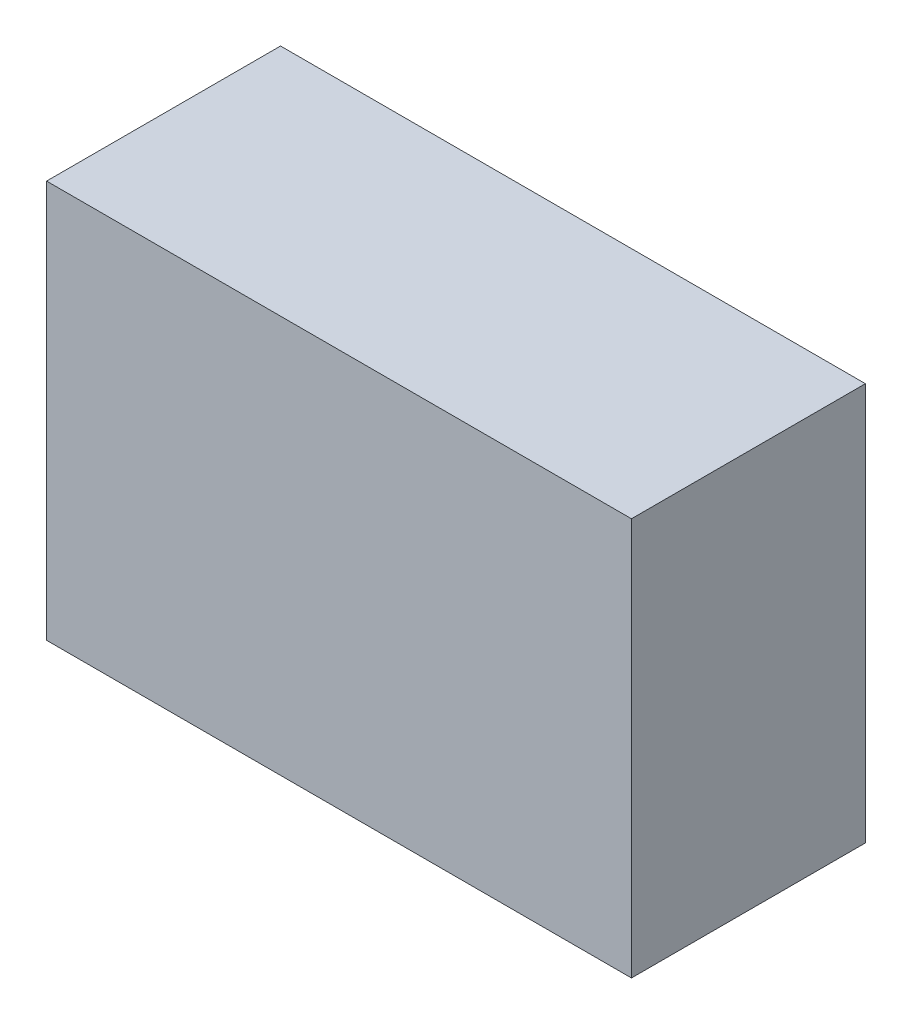
ISO-10303-21;
HEADER;
FILE_DESCRIPTION(('STEP AP214'),'2;1');
FILE_NAME('part.step','',(''),(''),'','','');
FILE_SCHEMA(('AUTOMOTIVE_DESIGN { 1 0 10303 214 1 1 1 1 }'));
ENDSEC;
DATA;
#1=APPLICATION_CONTEXT('core data for automotive mechanical design processes');
#2=APPLICATION_PROTOCOL_DEFINITION('international standard','automotive_design',2000,#1);
#3=PRODUCT_CONTEXT('',#1,'mechanical');
#4=PRODUCT('Part','Part','',(#3));
#5=PRODUCT_RELATED_PRODUCT_CATEGORY('part','',(#4));
#6=PRODUCT_DEFINITION_FORMATION('','',#4);
#7=PRODUCT_DEFINITION_CONTEXT('part definition',#1,'design');
#8=PRODUCT_DEFINITION('design','',#6,#7);
#9=PRODUCT_DEFINITION_SHAPE('','',#8);
#10=(LENGTH_UNIT() NAMED_UNIT(*) SI_UNIT(.MILLI.,.METRE.));
#11=(NAMED_UNIT(*) PLANE_ANGLE_UNIT() SI_UNIT($,.RADIAN.));
#12=(NAMED_UNIT(*) SI_UNIT($,.STERADIAN.) SOLID_ANGLE_UNIT());
#13=UNCERTAINTY_MEASURE_WITH_UNIT(LENGTH_MEASURE(1.E-05),#10,'distance_accuracy_value','');
#14=(GEOMETRIC_REPRESENTATION_CONTEXT(3) GLOBAL_UNCERTAINTY_ASSIGNED_CONTEXT((#13)) GLOBAL_UNIT_ASSIGNED_CONTEXT((#10,
#11,#12)) REPRESENTATION_CONTEXT('',''));
#15=CARTESIAN_POINT('',(0.,0.,0.));
#16=DIRECTION('',(0.,0.,1.));
#17=DIRECTION('',(1.,0.,0.));
#18=AXIS2_PLACEMENT_3D('',#15,#16,#17);
#19=CARTESIAN_POINT('',(-40.4296875,27.5390625,-20.));
#20=DIRECTION('',(-1.,0.,0.));
#21=DIRECTION('',(0.,0.,1.));
#22=AXIS2_PLACEMENT_3D('',#19,#20,#21);
#23=PLANE('',#22);
#24=DIRECTION('',(0.,-1.,0.));
#25=VECTOR('',#24,1.);
#26=CARTESIAN_POINT('',(-40.4296875,27.5390625,0.));
#27=LINE('',#26,#25);
#28=CARTESIAN_POINT('',(-40.4296875,27.5390625,0.));
#29=VERTEX_POINT('',#28);
#30=CARTESIAN_POINT('',(-40.4296875,-6.46093750000001,0.));
#31=VERTEX_POINT('',#30);
#32=EDGE_CURVE('E109',#29,#31,#27,.T.);
#33=ORIENTED_EDGE('',*,*,#32,.F.);
#34=DIRECTION('',(0.,0.,1.));
#35=VECTOR('',#34,1.);
#36=CARTESIAN_POINT('',(-40.4296875,27.5390625,-20.));
#37=LINE('',#36,#35);
#38=CARTESIAN_POINT('',(-40.4296875,27.5390625,-20.));
#39=VERTEX_POINT('',#38);
#40=EDGE_CURVE('E11',#39,#29,#37,.T.);
#41=ORIENTED_EDGE('',*,*,#40,.F.);
#42=DIRECTION('',(0.,-1.,0.));
#43=VECTOR('',#42,1.);
#44=CARTESIAN_POINT('',(-40.4296875,27.5390625,-20.));
#45=LINE('',#44,#43);
#46=CARTESIAN_POINT('',(-40.4296875,-6.46093750000001,-20.));
#47=VERTEX_POINT('',#46);
#48=EDGE_CURVE('E101',#39,#47,#45,.T.);
#49=ORIENTED_EDGE('',*,*,#48,.T.);
#50=DIRECTION('',(0.,0.,1.));
#51=VECTOR('',#50,1.);
#52=CARTESIAN_POINT('',(-40.4296875,-6.46093750000001,-20.));
#53=LINE('',#52,#51);
#54=EDGE_CURVE('E42',#47,#31,#53,.T.);
#55=ORIENTED_EDGE('',*,*,#54,.T.);
#56=EDGE_LOOP('',(#33,#41,#49,#55));
#57=FACE_BOUND('',#56,.T.);
#58=ADVANCED_FACE('F39',(#57),#23,.T.);
#59=CARTESIAN_POINT('',(-40.4296875,27.5390625,-20.));
#60=DIRECTION('',(0.,1.,0.));
#61=DIRECTION('',(0.,0.,1.));
#62=AXIS2_PLACEMENT_3D('',#59,#60,#61);
#63=PLANE('',#62);
#64=DIRECTION('',(-1.,0.,0.));
#65=VECTOR('',#64,1.);
#66=CARTESIAN_POINT('',(-40.4296875,27.5390625,0.));
#67=LINE('',#66,#65);
#68=CARTESIAN_POINT('',(9.57031250000002,27.5390625,0.));
#69=VERTEX_POINT('',#68);
#70=EDGE_CURVE('E104',#69,#29,#67,.T.);
#71=ORIENTED_EDGE('',*,*,#70,.F.);
#72=DIRECTION('',(0.,0.,1.));
#73=VECTOR('',#72,1.);
#74=CARTESIAN_POINT('',(9.57031250000002,27.5390625,-20.));
#75=LINE('',#74,#73);
#76=CARTESIAN_POINT('',(9.57031250000002,27.5390625,-20.));
#77=VERTEX_POINT('',#76);
#78=EDGE_CURVE('E49',#77,#69,#75,.T.);
#79=ORIENTED_EDGE('',*,*,#78,.F.);
#80=DIRECTION('',(-1.,0.,0.));
#81=VECTOR('',#80,1.);
#82=CARTESIAN_POINT('',(-40.4296875,27.5390625,-20.));
#83=LINE('',#82,#81);
#84=EDGE_CURVE('E96',#77,#39,#83,.T.);
#85=ORIENTED_EDGE('',*,*,#84,.T.);
#86=ORIENTED_EDGE('',*,*,#40,.T.);
#87=EDGE_LOOP('',(#71,#79,#85,#86));
#88=FACE_BOUND('',#87,.T.);
#89=ADVANCED_FACE('F125',(#88),#63,.T.);
#90=CARTESIAN_POINT('',(9.57031250000002,27.5390625,-20.));
#91=DIRECTION('',(1.,0.,0.));
#92=DIRECTION('',(0.,1.,0.));
#93=AXIS2_PLACEMENT_3D('',#90,#91,#92);
#94=PLANE('',#93);
#95=DIRECTION('',(0.,1.,0.));
#96=VECTOR('',#95,1.);
#97=CARTESIAN_POINT('',(9.57031250000002,27.5390625,0.));
#98=LINE('',#97,#96);
#99=CARTESIAN_POINT('',(9.57031250000002,-6.46093750000001,0.));
#100=VERTEX_POINT('',#99);
#101=EDGE_CURVE('E90',#100,#69,#98,.T.);
#102=ORIENTED_EDGE('',*,*,#101,.F.);
#103=DIRECTION('',(0.,0.,1.));
#104=VECTOR('',#103,1.);
#105=CARTESIAN_POINT('',(9.57031250000002,-6.46093750000001,-20.));
#106=LINE('',#105,#104);
#107=CARTESIAN_POINT('',(9.57031250000002,-6.46093750000001,-20.));
#108=VERTEX_POINT('',#107);
#109=EDGE_CURVE('E85',#108,#100,#106,.T.);
#110=ORIENTED_EDGE('',*,*,#109,.F.);
#111=DIRECTION('',(0.,1.,0.));
#112=VECTOR('',#111,1.);
#113=CARTESIAN_POINT('',(9.57031250000002,27.5390625,-20.));
#114=LINE('',#113,#112);
#115=EDGE_CURVE('E88',#108,#77,#114,.T.);
#116=ORIENTED_EDGE('',*,*,#115,.T.);
#117=ORIENTED_EDGE('',*,*,#78,.T.);
#118=EDGE_LOOP('',(#102,#110,#116,#117));
#119=FACE_BOUND('',#118,.T.);
#120=ADVANCED_FACE('F87',(#119),#94,.T.);
#121=CARTESIAN_POINT('',(-40.4296875,-6.46093750000001,-20.));
#122=DIRECTION('',(0.,-1.,0.));
#123=DIRECTION('',(0.,0.,-1.));
#124=AXIS2_PLACEMENT_3D('',#121,#122,#123);
#125=PLANE('',#124);
#126=DIRECTION('',(1.,0.,0.));
#127=VECTOR('',#126,1.);
#128=CARTESIAN_POINT('',(-40.4296875,-6.46093750000001,0.));
#129=LINE('',#128,#127);
#130=EDGE_CURVE('E113',#31,#100,#129,.T.);
#131=ORIENTED_EDGE('',*,*,#130,.F.);
#132=ORIENTED_EDGE('',*,*,#54,.F.);
#133=DIRECTION('',(1.,0.,0.));
#134=VECTOR('',#133,1.);
#135=CARTESIAN_POINT('',(-40.4296875,-6.46093750000001,-20.));
#136=LINE('',#135,#134);
#137=EDGE_CURVE('E95',#47,#108,#136,.T.);
#138=ORIENTED_EDGE('',*,*,#137,.T.);
#139=ORIENTED_EDGE('',*,*,#109,.T.);
#140=EDGE_LOOP('',(#131,#132,#138,#139));
#141=FACE_BOUND('',#140,.T.);
#142=ADVANCED_FACE('F99',(#141),#125,.T.);
#143=CARTESIAN_POINT('',(0.,0.,-20.));
#144=DIRECTION('',(0.,0.,1.));
#145=DIRECTION('',(1.,0.,0.));
#146=AXIS2_PLACEMENT_3D('',#143,#144,#145);
#147=PLANE('',#146);
#148=ORIENTED_EDGE('',*,*,#48,.F.);
#149=ORIENTED_EDGE('',*,*,#84,.F.);
#150=ORIENTED_EDGE('',*,*,#115,.F.);
#151=ORIENTED_EDGE('',*,*,#137,.F.);
#152=EDGE_LOOP('',(#148,#149,#150,#151));
#153=FACE_BOUND('',#152,.T.);
#154=ADVANCED_FACE('F94',(#153),#147,.F.);
#155=CARTESIAN_POINT('',(0.,0.,0.));
#156=DIRECTION('',(0.,0.,1.));
#157=DIRECTION('',(1.,0.,0.));
#158=AXIS2_PLACEMENT_3D('',#155,#156,#157);
#159=PLANE('',#158);
#160=ORIENTED_EDGE('',*,*,#32,.T.);
#161=ORIENTED_EDGE('',*,*,#130,.T.);
#162=ORIENTED_EDGE('',*,*,#101,.T.);
#163=ORIENTED_EDGE('',*,*,#70,.T.);
#164=EDGE_LOOP('',(#160,#161,#162,#163));
#165=FACE_BOUND('',#164,.T.);
#166=ADVANCED_FACE('F124',(#165),#159,.T.);
#167=CLOSED_SHELL('',(#58,#89,#120,#142,#154,#166));
#168=MANIFOLD_SOLID_BREP('B2',#167);
#169=ADVANCED_BREP_SHAPE_REPRESENTATION('',(#18,#168),#14);
#170=SHAPE_DEFINITION_REPRESENTATION(#9,#169);
ENDSEC;
END-ISO-10303-21;
